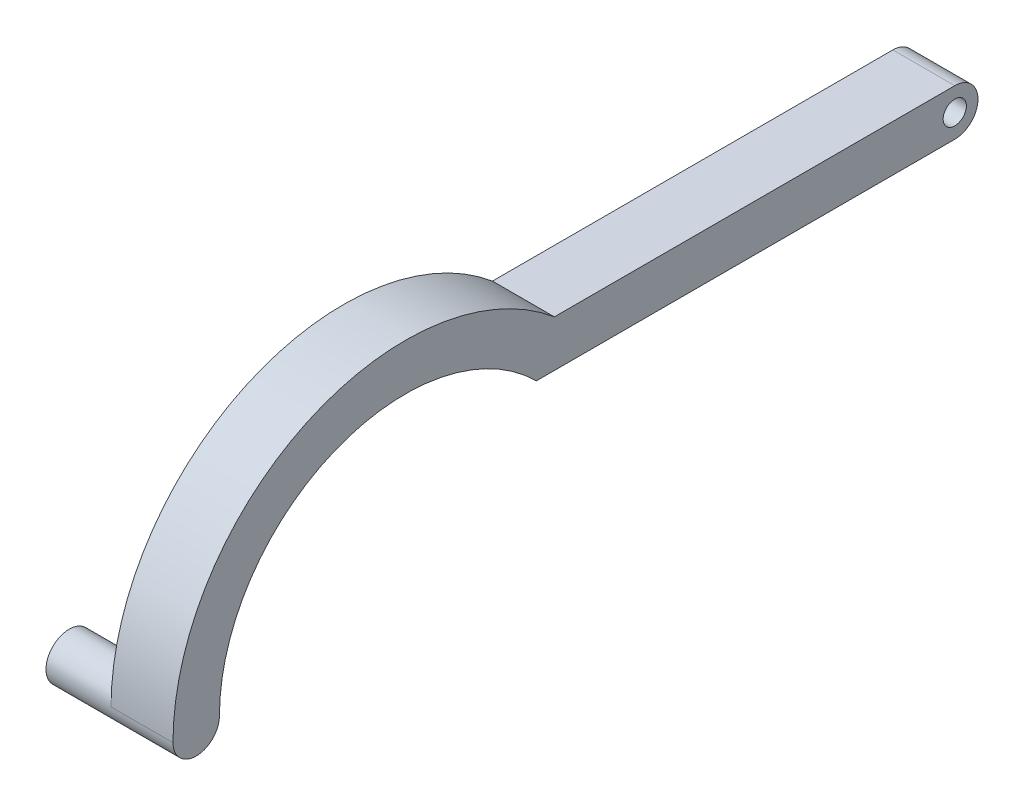
ISO-10303-21;
HEADER;
FILE_DESCRIPTION(('STEP AP214'),'2;1');
FILE_NAME('part.step','',(''),(''),'','','');
FILE_SCHEMA(('AUTOMOTIVE_DESIGN { 1 0 10303 214 1 1 1 1 }'));
ENDSEC;
DATA;
#1=APPLICATION_CONTEXT('core data for automotive mechanical design processes');
#2=APPLICATION_PROTOCOL_DEFINITION('international standard','automotive_design',2000,#1);
#3=PRODUCT_CONTEXT('',#1,'mechanical');
#4=PRODUCT('Part','Part','',(#3));
#5=PRODUCT_RELATED_PRODUCT_CATEGORY('part','',(#4));
#6=PRODUCT_DEFINITION_FORMATION('','',#4);
#7=PRODUCT_DEFINITION_CONTEXT('part definition',#1,'design');
#8=PRODUCT_DEFINITION('design','',#6,#7);
#9=PRODUCT_DEFINITION_SHAPE('','',#8);
#10=(LENGTH_UNIT() NAMED_UNIT(*) SI_UNIT(.MILLI.,.METRE.));
#11=(NAMED_UNIT(*) PLANE_ANGLE_UNIT() SI_UNIT($,.RADIAN.));
#12=(NAMED_UNIT(*) SI_UNIT($,.STERADIAN.) SOLID_ANGLE_UNIT());
#13=UNCERTAINTY_MEASURE_WITH_UNIT(LENGTH_MEASURE(1.E-05),#10,'distance_accuracy_value','');
#14=(GEOMETRIC_REPRESENTATION_CONTEXT(3) GLOBAL_UNCERTAINTY_ASSIGNED_CONTEXT((#13)) GLOBAL_UNIT_ASSIGNED_CONTEXT((#10,
#11,#12)) REPRESENTATION_CONTEXT('',''));
#15=CARTESIAN_POINT('',(0.,0.,0.));
#16=DIRECTION('',(0.,0.,1.));
#17=DIRECTION('',(1.,0.,0.));
#18=AXIS2_PLACEMENT_3D('',#15,#16,#17);
#19=CARTESIAN_POINT('',(0.,10.,-48.9897948556636));
#20=DIRECTION('',(1.,0.,0.));
#21=DIRECTION('',(0.,0.,-1.));
#22=AXIS2_PLACEMENT_3D('',#19,#20,#21);
#23=PLANE('',#22);
#24=CARTESIAN_POINT('',(0.,10.,-48.9897948556636));
#25=DIRECTION('',(1.,0.,0.));
#26=DIRECTION('',(0.,0.,-1.));
#27=AXIS2_PLACEMENT_3D('',#24,#25,#26);
#28=CIRCLE('',#27,0.749999999999999);
#29=CARTESIAN_POINT('',(0.,10.,-49.7397948556636));
#30=VERTEX_POINT('',#29);
#31=EDGE_CURVE('E142',#30,#30,#28,.T.);
#32=ORIENTED_EDGE('',*,*,#31,.T.);
#33=EDGE_LOOP('',(#32));
#34=FACE_BOUND('',#33,.T.);
#35=CARTESIAN_POINT('',(0.,0.,0.));
#36=DIRECTION('',(-1.,0.,0.));
#37=DIRECTION('',(0.,0.,1.));
#38=AXIS2_PLACEMENT_3D('',#35,#36,#37);
#39=CIRCLE('',#38,1.5);
#40=CARTESIAN_POINT('',(0.,0.,1.5));
#41=VERTEX_POINT('',#40);
#42=CARTESIAN_POINT('',(0.,0.,-1.5));
#43=VERTEX_POINT('',#42);
#44=EDGE_CURVE('E109',#41,#43,#39,.T.);
#45=ORIENTED_EDGE('',*,*,#44,.F.);
#46=CARTESIAN_POINT('',(0.,0.,-13.5));
#47=DIRECTION('',(1.,0.,0.));
#48=DIRECTION('',(0.,0.,-1.));
#49=AXIS2_PLACEMENT_3D('',#46,#47,#48);
#50=CIRCLE('',#49,15.);
#51=CARTESIAN_POINT('',(0.,11.5,-23.1306801421291));
#52=VERTEX_POINT('',#51);
#53=EDGE_CURVE('E125',#52,#41,#50,.T.);
#54=ORIENTED_EDGE('',*,*,#53,.F.);
#55=DIRECTION('',(0.,0.,1.));
#56=VECTOR('',#55,1.);
#57=CARTESIAN_POINT('',(0.,11.5,-48.9897948556636));
#58=LINE('',#57,#56);
#59=CARTESIAN_POINT('',(0.,11.5,-48.9897948556636));
#60=VERTEX_POINT('',#59);
#61=EDGE_CURVE('E122',#60,#52,#58,.T.);
#62=ORIENTED_EDGE('',*,*,#61,.F.);
#63=CARTESIAN_POINT('',(0.,10.,-48.9897948556636));
#64=DIRECTION('',(1.,0.,0.));
#65=DIRECTION('',(0.,0.,-1.));
#66=AXIS2_PLACEMENT_3D('',#63,#64,#65);
#67=CIRCLE('',#66,1.5);
#68=CARTESIAN_POINT('',(0.,8.5,-48.9897948556636));
#69=VERTEX_POINT('',#68);
#70=EDGE_CURVE('E119',#69,#60,#67,.T.);
#71=ORIENTED_EDGE('',*,*,#70,.F.);
#72=DIRECTION('',(0.,0.,-1.));
#73=VECTOR('',#72,1.);
#74=CARTESIAN_POINT('',(0.,8.5,-48.9897948556636));
#75=LINE('',#74,#73);
#76=CARTESIAN_POINT('',(0.,8.49999999999999,-21.9705371730487));
#77=VERTEX_POINT('',#76);
#78=EDGE_CURVE('E77',#77,#69,#75,.T.);
#79=ORIENTED_EDGE('',*,*,#78,.F.);
#80=CARTESIAN_POINT('',(0.,0.,-13.5));
#81=DIRECTION('',(-1.,0.,0.));
#82=DIRECTION('',(0.,0.,1.));
#83=AXIS2_PLACEMENT_3D('',#80,#81,#82);
#84=CIRCLE('',#83,12.);
#85=EDGE_CURVE('E71',#43,#77,#84,.T.);
#86=ORIENTED_EDGE('',*,*,#85,.F.);
#87=EDGE_LOOP('',(#45,#54,#62,#71,#79,#86));
#88=FACE_BOUND('',#87,.T.);
#89=ADVANCED_FACE('F33',(#34,#88),#23,.F.);
#90=CARTESIAN_POINT('',(4.,10.,-48.9897948556636));
#91=DIRECTION('',(1.,0.,0.));
#92=DIRECTION('',(0.,0.,-1.));
#93=AXIS2_PLACEMENT_3D('',#90,#91,#92);
#94=PLANE('',#93);
#95=CARTESIAN_POINT('',(4.,10.,-48.9897948556636));
#96=DIRECTION('',(1.,0.,0.));
#97=DIRECTION('',(0.,0.,-1.));
#98=AXIS2_PLACEMENT_3D('',#95,#96,#97);
#99=CIRCLE('',#98,1.5);
#100=CARTESIAN_POINT('',(4.,8.5,-48.9897948556636));
#101=VERTEX_POINT('',#100);
#102=CARTESIAN_POINT('',(4.,11.5,-48.9897948556636));
#103=VERTEX_POINT('',#102);
#104=EDGE_CURVE('E130',#101,#103,#99,.T.);
#105=ORIENTED_EDGE('',*,*,#104,.T.);
#106=DIRECTION('',(0.,0.,1.));
#107=VECTOR('',#106,1.);
#108=CARTESIAN_POINT('',(4.,11.5,-48.9897948556636));
#109=LINE('',#108,#107);
#110=CARTESIAN_POINT('',(4.,11.5,-23.1306801421291));
#111=VERTEX_POINT('',#110);
#112=EDGE_CURVE('E85',#103,#111,#109,.T.);
#113=ORIENTED_EDGE('',*,*,#112,.T.);
#114=CARTESIAN_POINT('',(4.,0.,-13.5));
#115=DIRECTION('',(1.,0.,0.));
#116=DIRECTION('',(0.,0.,-1.));
#117=AXIS2_PLACEMENT_3D('',#114,#115,#116);
#118=CIRCLE('',#117,15.);
#119=CARTESIAN_POINT('',(4.,0.,1.5));
#120=VERTEX_POINT('',#119);
#121=EDGE_CURVE('E100',#111,#120,#118,.T.);
#122=ORIENTED_EDGE('',*,*,#121,.T.);
#123=CARTESIAN_POINT('',(4.,0.,0.));
#124=DIRECTION('',(1.,0.,0.));
#125=DIRECTION('',(0.,0.,-1.));
#126=AXIS2_PLACEMENT_3D('',#123,#124,#125);
#127=CIRCLE('',#126,1.5);
#128=CARTESIAN_POINT('',(4.,0.,-1.5));
#129=VERTEX_POINT('',#128);
#130=EDGE_CURVE('E93',#120,#129,#127,.T.);
#131=ORIENTED_EDGE('',*,*,#130,.T.);
#132=CARTESIAN_POINT('',(4.,0.,-13.5));
#133=DIRECTION('',(-1.,0.,0.));
#134=DIRECTION('',(0.,0.,1.));
#135=AXIS2_PLACEMENT_3D('',#132,#133,#134);
#136=CIRCLE('',#135,12.);
#137=CARTESIAN_POINT('',(4.,8.49999999999999,-21.9705371730487));
#138=VERTEX_POINT('',#137);
#139=EDGE_CURVE('E98',#129,#138,#136,.T.);
#140=ORIENTED_EDGE('',*,*,#139,.T.);
#141=DIRECTION('',(0.,0.,-1.));
#142=VECTOR('',#141,1.);
#143=CARTESIAN_POINT('',(4.,8.5,-48.9897948556636));
#144=LINE('',#143,#142);
#145=EDGE_CURVE('E50',#138,#101,#144,.T.);
#146=ORIENTED_EDGE('',*,*,#145,.T.);
#147=EDGE_LOOP('',(#105,#113,#122,#131,#140,#146));
#148=FACE_BOUND('',#147,.T.);
#149=CARTESIAN_POINT('',(4.,10.,-48.9897948556636));
#150=DIRECTION('',(1.,0.,0.));
#151=DIRECTION('',(0.,0.,-1.));
#152=AXIS2_PLACEMENT_3D('',#149,#150,#151);
#153=CIRCLE('',#152,0.749999999999999);
#154=CARTESIAN_POINT('',(4.,10.,-49.7397948556636));
#155=VERTEX_POINT('',#154);
#156=EDGE_CURVE('E123',#155,#155,#153,.T.);
#157=ORIENTED_EDGE('',*,*,#156,.F.);
#158=EDGE_LOOP('',(#157));
#159=FACE_BOUND('',#158,.T.);
#160=ADVANCED_FACE('F95',(#148,#159),#94,.T.);
#161=CARTESIAN_POINT('',(4.,10.,-48.9897948556636));
#162=DIRECTION('',(-1.,0.,0.));
#163=DIRECTION('',(0.,0.,1.));
#164=AXIS2_PLACEMENT_3D('',#161,#162,#163);
#165=CYLINDRICAL_SURFACE('',#164,1.5);
#166=ORIENTED_EDGE('',*,*,#70,.T.);
#167=DIRECTION('',(-1.,0.,0.));
#168=VECTOR('',#167,1.);
#169=CARTESIAN_POINT('',(4.,11.5,-48.9897948556636));
#170=LINE('',#169,#168);
#171=EDGE_CURVE('E11',#103,#60,#170,.T.);
#172=ORIENTED_EDGE('',*,*,#171,.F.);
#173=ORIENTED_EDGE('',*,*,#104,.F.);
#174=DIRECTION('',(-1.,0.,0.));
#175=VECTOR('',#174,1.);
#176=CARTESIAN_POINT('',(4.,8.5,-48.9897948556636));
#177=LINE('',#176,#175);
#178=EDGE_CURVE('E115',#101,#69,#177,.T.);
#179=ORIENTED_EDGE('',*,*,#178,.T.);
#180=EDGE_LOOP('',(#166,#172,#173,#179));
#181=FACE_BOUND('',#180,.T.);
#182=ADVANCED_FACE('F35',(#181),#165,.T.);
#183=CARTESIAN_POINT('',(4.,11.5,-48.9897948556636));
#184=DIRECTION('',(0.,-1.,0.));
#185=DIRECTION('',(0.,0.,-1.));
#186=AXIS2_PLACEMENT_3D('',#183,#184,#185);
#187=PLANE('',#186);
#188=ORIENTED_EDGE('',*,*,#61,.T.);
#189=DIRECTION('',(-1.,0.,0.));
#190=VECTOR('',#189,1.);
#191=CARTESIAN_POINT('',(4.,11.5,-23.1306801421291));
#192=LINE('',#191,#190);
#193=EDGE_CURVE('E42',#111,#52,#192,.T.);
#194=ORIENTED_EDGE('',*,*,#193,.F.);
#195=ORIENTED_EDGE('',*,*,#112,.F.);
#196=ORIENTED_EDGE('',*,*,#171,.T.);
#197=EDGE_LOOP('',(#188,#194,#195,#196));
#198=FACE_BOUND('',#197,.T.);
#199=ADVANCED_FACE('F153',(#198),#187,.F.);
#200=CARTESIAN_POINT('',(4.,0.,-13.5));
#201=DIRECTION('',(-1.,0.,0.));
#202=DIRECTION('',(0.,0.,1.));
#203=AXIS2_PLACEMENT_3D('',#200,#201,#202);
#204=CYLINDRICAL_SURFACE('',#203,15.);
#205=ORIENTED_EDGE('',*,*,#53,.T.);
#206=DIRECTION('',(-1.,0.,0.));
#207=VECTOR('',#206,1.);
#208=CARTESIAN_POINT('',(4.,0.,1.5));
#209=LINE('',#208,#207);
#210=EDGE_CURVE('E110',#120,#41,#209,.T.);
#211=ORIENTED_EDGE('',*,*,#210,.F.);
#212=ORIENTED_EDGE('',*,*,#121,.F.);
#213=ORIENTED_EDGE('',*,*,#193,.T.);
#214=EDGE_LOOP('',(#205,#211,#212,#213));
#215=FACE_BOUND('',#214,.T.);
#216=ADVANCED_FACE('F136',(#215),#204,.T.);
#217=CARTESIAN_POINT('',(4.,0.,0.));
#218=DIRECTION('',(-1.,0.,0.));
#219=DIRECTION('',(0.,0.,1.));
#220=AXIS2_PLACEMENT_3D('',#217,#218,#219);
#221=CYLINDRICAL_SURFACE('',#220,1.5);
#222=ORIENTED_EDGE('',*,*,#210,.T.);
#223=ORIENTED_EDGE('',*,*,#44,.T.);
#224=DIRECTION('',(-1.,0.,0.));
#225=VECTOR('',#224,1.);
#226=CARTESIAN_POINT('',(4.,0.,-1.5));
#227=LINE('',#226,#225);
#228=EDGE_CURVE('E105',#129,#43,#227,.T.);
#229=ORIENTED_EDGE('',*,*,#228,.F.);
#230=ORIENTED_EDGE('',*,*,#130,.F.);
#231=EDGE_LOOP('',(#222,#223,#229,#230));
#232=FACE_BOUND('',#231,.T.);
#233=CARTESIAN_POINT('',(-4.2,0.,0.));
#234=DIRECTION('',(-1.,0.,0.));
#235=DIRECTION('',(0.,0.,1.));
#236=AXIS2_PLACEMENT_3D('',#233,#234,#235);
#237=CIRCLE('',#236,1.5);
#238=CARTESIAN_POINT('',(-4.2,0.,1.5));
#239=VERTEX_POINT('',#238);
#240=EDGE_CURVE('E139',#239,#239,#237,.T.);
#241=ORIENTED_EDGE('',*,*,#240,.F.);
#242=EDGE_LOOP('',(#241));
#243=FACE_BOUND('',#242,.T.);
#244=ADVANCED_FACE('F106',(#232,#243),#221,.T.);
#245=CARTESIAN_POINT('',(4.,0.,-13.5));
#246=DIRECTION('',(-1.,0.,0.));
#247=DIRECTION('',(0.,0.,1.));
#248=AXIS2_PLACEMENT_3D('',#245,#246,#247);
#249=CYLINDRICAL_SURFACE('',#248,12.);
#250=ORIENTED_EDGE('',*,*,#85,.T.);
#251=DIRECTION('',(-1.,0.,0.));
#252=VECTOR('',#251,1.);
#253=CARTESIAN_POINT('',(4.,8.49999999999999,-21.9705371730487));
#254=LINE('',#253,#252);
#255=EDGE_CURVE('E111',#138,#77,#254,.T.);
#256=ORIENTED_EDGE('',*,*,#255,.F.);
#257=ORIENTED_EDGE('',*,*,#139,.F.);
#258=ORIENTED_EDGE('',*,*,#228,.T.);
#259=EDGE_LOOP('',(#250,#256,#257,#258));
#260=FACE_BOUND('',#259,.T.);
#261=ADVANCED_FACE('F113',(#260),#249,.F.);
#262=CARTESIAN_POINT('',(4.,8.5,-48.9897948556636));
#263=DIRECTION('',(0.,1.,0.));
#264=DIRECTION('',(0.,0.,1.));
#265=AXIS2_PLACEMENT_3D('',#262,#263,#264);
#266=PLANE('',#265);
#267=ORIENTED_EDGE('',*,*,#78,.T.);
#268=ORIENTED_EDGE('',*,*,#178,.F.);
#269=ORIENTED_EDGE('',*,*,#145,.F.);
#270=ORIENTED_EDGE('',*,*,#255,.T.);
#271=EDGE_LOOP('',(#267,#268,#269,#270));
#272=FACE_BOUND('',#271,.T.);
#273=ADVANCED_FACE('F169',(#272),#266,.F.);
#274=CARTESIAN_POINT('',(4.,10.,-48.9897948556636));
#275=DIRECTION('',(-1.,0.,0.));
#276=DIRECTION('',(0.,0.,1.));
#277=AXIS2_PLACEMENT_3D('',#274,#275,#276);
#278=CYLINDRICAL_SURFACE('',#277,0.749999999999999);
#279=ORIENTED_EDGE('',*,*,#156,.T.);
#280=EDGE_LOOP('',(#279));
#281=FACE_BOUND('',#280,.T.);
#282=ORIENTED_EDGE('',*,*,#31,.F.);
#283=EDGE_LOOP('',(#282));
#284=FACE_BOUND('',#283,.T.);
#285=ADVANCED_FACE('F172',(#281,#284),#278,.F.);
#286=CARTESIAN_POINT('',(-4.2,0.,0.));
#287=DIRECTION('',(-1.,0.,0.));
#288=DIRECTION('',(0.,0.,1.));
#289=AXIS2_PLACEMENT_3D('',#286,#287,#288);
#290=PLANE('',#289);
#291=ORIENTED_EDGE('',*,*,#240,.T.);
#292=EDGE_LOOP('',(#291));
#293=FACE_BOUND('',#292,.T.);
#294=ADVANCED_FACE('F195',(#293),#290,.T.);
#295=CLOSED_SHELL('',(#89,#160,#182,#199,#216,#244,#261,#273,#285,#294));
#296=MANIFOLD_SOLID_BREP('B2',#295);
#297=ADVANCED_BREP_SHAPE_REPRESENTATION('',(#18,#296),#14);
#298=SHAPE_DEFINITION_REPRESENTATION(#9,#297);
ENDSEC;
END-ISO-10303-21;
